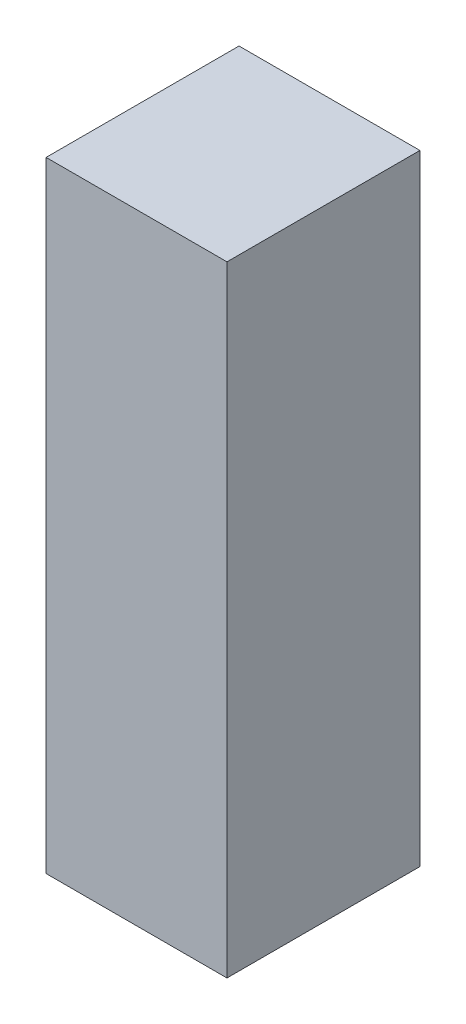
ISO-10303-21;
HEADER;
FILE_DESCRIPTION(('STEP AP214'),'2;1');
FILE_NAME('part.step','',(''),(''),'','','');
FILE_SCHEMA(('AUTOMOTIVE_DESIGN { 1 0 10303 214 1 1 1 1 }'));
ENDSEC;
DATA;
#1=APPLICATION_CONTEXT('core data for automotive mechanical design processes');
#2=APPLICATION_PROTOCOL_DEFINITION('international standard','automotive_design',2000,#1);
#3=PRODUCT_CONTEXT('',#1,'mechanical');
#4=PRODUCT('Part','Part','',(#3));
#5=PRODUCT_RELATED_PRODUCT_CATEGORY('part','',(#4));
#6=PRODUCT_DEFINITION_FORMATION('','',#4);
#7=PRODUCT_DEFINITION_CONTEXT('part definition',#1,'design');
#8=PRODUCT_DEFINITION('design','',#6,#7);
#9=PRODUCT_DEFINITION_SHAPE('','',#8);
#10=(LENGTH_UNIT() NAMED_UNIT(*) SI_UNIT(.MILLI.,.METRE.));
#11=(NAMED_UNIT(*) PLANE_ANGLE_UNIT() SI_UNIT($,.RADIAN.));
#12=(NAMED_UNIT(*) SI_UNIT($,.STERADIAN.) SOLID_ANGLE_UNIT());
#13=UNCERTAINTY_MEASURE_WITH_UNIT(LENGTH_MEASURE(1.E-05),#10,'distance_accuracy_value','');
#14=(GEOMETRIC_REPRESENTATION_CONTEXT(3) GLOBAL_UNCERTAINTY_ASSIGNED_CONTEXT((#13)) GLOBAL_UNIT_ASSIGNED_CONTEXT((#10,
#11,#12)) REPRESENTATION_CONTEXT('',''));
#15=CARTESIAN_POINT('',(0.,0.,0.));
#16=DIRECTION('',(0.,0.,1.));
#17=DIRECTION('',(1.,0.,0.));
#18=AXIS2_PLACEMENT_3D('',#15,#16,#17);
#19=CARTESIAN_POINT('',(-15.,102.87,16.));
#20=DIRECTION('',(1.,0.,0.));
#21=DIRECTION('',(0.,0.,-1.));
#22=AXIS2_PLACEMENT_3D('',#19,#20,#21);
#23=PLANE('',#22);
#24=DIRECTION('',(0.,0.,1.));
#25=VECTOR('',#24,1.);
#26=CARTESIAN_POINT('',(-15.,0.,16.));
#27=LINE('',#26,#25);
#28=CARTESIAN_POINT('',(-15.,0.,-16.));
#29=VERTEX_POINT('',#28);
#30=CARTESIAN_POINT('',(-15.,0.,16.));
#31=VERTEX_POINT('',#30);
#32=EDGE_CURVE('E109',#29,#31,#27,.T.);
#33=ORIENTED_EDGE('',*,*,#32,.T.);
#34=DIRECTION('',(0.,-1.,0.));
#35=VECTOR('',#34,1.);
#36=CARTESIAN_POINT('',(-15.,102.87,16.));
#37=LINE('',#36,#35);
#38=CARTESIAN_POINT('',(-15.,102.87,16.));
#39=VERTEX_POINT('',#38);
#40=EDGE_CURVE('E11',#39,#31,#37,.T.);
#41=ORIENTED_EDGE('',*,*,#40,.F.);
#42=DIRECTION('',(0.,0.,1.));
#43=VECTOR('',#42,1.);
#44=CARTESIAN_POINT('',(-15.,102.87,16.));
#45=LINE('',#44,#43);
#46=CARTESIAN_POINT('',(-15.,102.87,-16.));
#47=VERTEX_POINT('',#46);
#48=EDGE_CURVE('E93',#47,#39,#45,.T.);
#49=ORIENTED_EDGE('',*,*,#48,.F.);
#50=DIRECTION('',(0.,-1.,0.));
#51=VECTOR('',#50,1.);
#52=CARTESIAN_POINT('',(-15.,102.87,-16.));
#53=LINE('',#52,#51);
#54=EDGE_CURVE('E105',#47,#29,#53,.T.);
#55=ORIENTED_EDGE('',*,*,#54,.T.);
#56=EDGE_LOOP('',(#33,#41,#49,#55));
#57=FACE_BOUND('',#56,.T.);
#58=ADVANCED_FACE('F41',(#57),#23,.F.);
#59=CARTESIAN_POINT('',(15.,102.87,16.));
#60=DIRECTION('',(0.,0.,-1.));
#61=DIRECTION('',(-1.,0.,0.));
#62=AXIS2_PLACEMENT_3D('',#59,#60,#61);
#63=PLANE('',#62);
#64=DIRECTION('',(1.,0.,0.));
#65=VECTOR('',#64,1.);
#66=CARTESIAN_POINT('',(15.,0.,16.));
#67=LINE('',#66,#65);
#68=CARTESIAN_POINT('',(15.,0.,16.));
#69=VERTEX_POINT('',#68);
#70=EDGE_CURVE('E98',#31,#69,#67,.T.);
#71=ORIENTED_EDGE('',*,*,#70,.T.);
#72=DIRECTION('',(0.,-1.,0.));
#73=VECTOR('',#72,1.);
#74=CARTESIAN_POINT('',(15.,102.87,16.));
#75=LINE('',#74,#73);
#76=CARTESIAN_POINT('',(15.,102.87,16.));
#77=VERTEX_POINT('',#76);
#78=EDGE_CURVE('E50',#77,#69,#75,.T.);
#79=ORIENTED_EDGE('',*,*,#78,.F.);
#80=DIRECTION('',(1.,0.,0.));
#81=VECTOR('',#80,1.);
#82=CARTESIAN_POINT('',(15.,102.87,16.));
#83=LINE('',#82,#81);
#84=EDGE_CURVE('E88',#39,#77,#83,.T.);
#85=ORIENTED_EDGE('',*,*,#84,.F.);
#86=ORIENTED_EDGE('',*,*,#40,.T.);
#87=EDGE_LOOP('',(#71,#79,#85,#86));
#88=FACE_BOUND('',#87,.T.);
#89=ADVANCED_FACE('F97',(#88),#63,.F.);
#90=CARTESIAN_POINT('',(15.,102.87,16.));
#91=DIRECTION('',(-1.,0.,0.));
#92=DIRECTION('',(0.,0.,1.));
#93=AXIS2_PLACEMENT_3D('',#90,#91,#92);
#94=PLANE('',#93);
#95=DIRECTION('',(0.,0.,-1.));
#96=VECTOR('',#95,1.);
#97=CARTESIAN_POINT('',(15.,0.,16.));
#98=LINE('',#97,#96);
#99=CARTESIAN_POINT('',(15.,0.,-16.));
#100=VERTEX_POINT('',#99);
#101=EDGE_CURVE('E75',#69,#100,#98,.T.);
#102=ORIENTED_EDGE('',*,*,#101,.T.);
#103=DIRECTION('',(0.,-1.,0.));
#104=VECTOR('',#103,1.);
#105=CARTESIAN_POINT('',(15.,102.87,-16.));
#106=LINE('',#105,#104);
#107=CARTESIAN_POINT('',(15.,102.87,-16.));
#108=VERTEX_POINT('',#107);
#109=EDGE_CURVE('E100',#108,#100,#106,.T.);
#110=ORIENTED_EDGE('',*,*,#109,.F.);
#111=DIRECTION('',(0.,0.,-1.));
#112=VECTOR('',#111,1.);
#113=CARTESIAN_POINT('',(15.,102.87,16.));
#114=LINE('',#113,#112);
#115=EDGE_CURVE('E91',#77,#108,#114,.T.);
#116=ORIENTED_EDGE('',*,*,#115,.F.);
#117=ORIENTED_EDGE('',*,*,#78,.T.);
#118=EDGE_LOOP('',(#102,#110,#116,#117));
#119=FACE_BOUND('',#118,.T.);
#120=ADVANCED_FACE('F101',(#119),#94,.F.);
#121=CARTESIAN_POINT('',(15.,102.87,-16.));
#122=DIRECTION('',(0.,0.,1.));
#123=DIRECTION('',(1.,0.,0.));
#124=AXIS2_PLACEMENT_3D('',#121,#122,#123);
#125=PLANE('',#124);
#126=DIRECTION('',(-1.,0.,0.));
#127=VECTOR('',#126,1.);
#128=CARTESIAN_POINT('',(15.,0.,-16.));
#129=LINE('',#128,#127);
#130=EDGE_CURVE('E81',#100,#29,#129,.T.);
#131=ORIENTED_EDGE('',*,*,#130,.T.);
#132=ORIENTED_EDGE('',*,*,#54,.F.);
#133=DIRECTION('',(-1.,0.,0.));
#134=VECTOR('',#133,1.);
#135=CARTESIAN_POINT('',(15.,102.87,-16.));
#136=LINE('',#135,#134);
#137=EDGE_CURVE('E58',#108,#47,#136,.T.);
#138=ORIENTED_EDGE('',*,*,#137,.F.);
#139=ORIENTED_EDGE('',*,*,#109,.T.);
#140=EDGE_LOOP('',(#131,#132,#138,#139));
#141=FACE_BOUND('',#140,.T.);
#142=ADVANCED_FACE('F122',(#141),#125,.F.);
#143=CARTESIAN_POINT('',(0.,102.87,0.));
#144=DIRECTION('',(0.,1.,0.));
#145=DIRECTION('',(0.,0.,1.));
#146=AXIS2_PLACEMENT_3D('',#143,#144,#145);
#147=PLANE('',#146);
#148=ORIENTED_EDGE('',*,*,#48,.T.);
#149=ORIENTED_EDGE('',*,*,#84,.T.);
#150=ORIENTED_EDGE('',*,*,#115,.T.);
#151=ORIENTED_EDGE('',*,*,#137,.T.);
#152=EDGE_LOOP('',(#148,#149,#150,#151));
#153=FACE_BOUND('',#152,.T.);
#154=ADVANCED_FACE('F89',(#153),#147,.T.);
#155=CARTESIAN_POINT('',(0.,0.,0.));
#156=DIRECTION('',(0.,1.,0.));
#157=DIRECTION('',(0.,0.,1.));
#158=AXIS2_PLACEMENT_3D('',#155,#156,#157);
#159=PLANE('',#158);
#160=ORIENTED_EDGE('',*,*,#32,.F.);
#161=ORIENTED_EDGE('',*,*,#130,.F.);
#162=ORIENTED_EDGE('',*,*,#101,.F.);
#163=ORIENTED_EDGE('',*,*,#70,.F.);
#164=EDGE_LOOP('',(#160,#161,#162,#163));
#165=FACE_BOUND('',#164,.T.);
#166=ADVANCED_FACE('F125',(#165),#159,.F.);
#167=CLOSED_SHELL('',(#58,#89,#120,#142,#154,#166));
#168=MANIFOLD_SOLID_BREP('B2',#167);
#169=ADVANCED_BREP_SHAPE_REPRESENTATION('',(#18,#168),#14);
#170=SHAPE_DEFINITION_REPRESENTATION(#9,#169);
ENDSEC;
END-ISO-10303-21;
